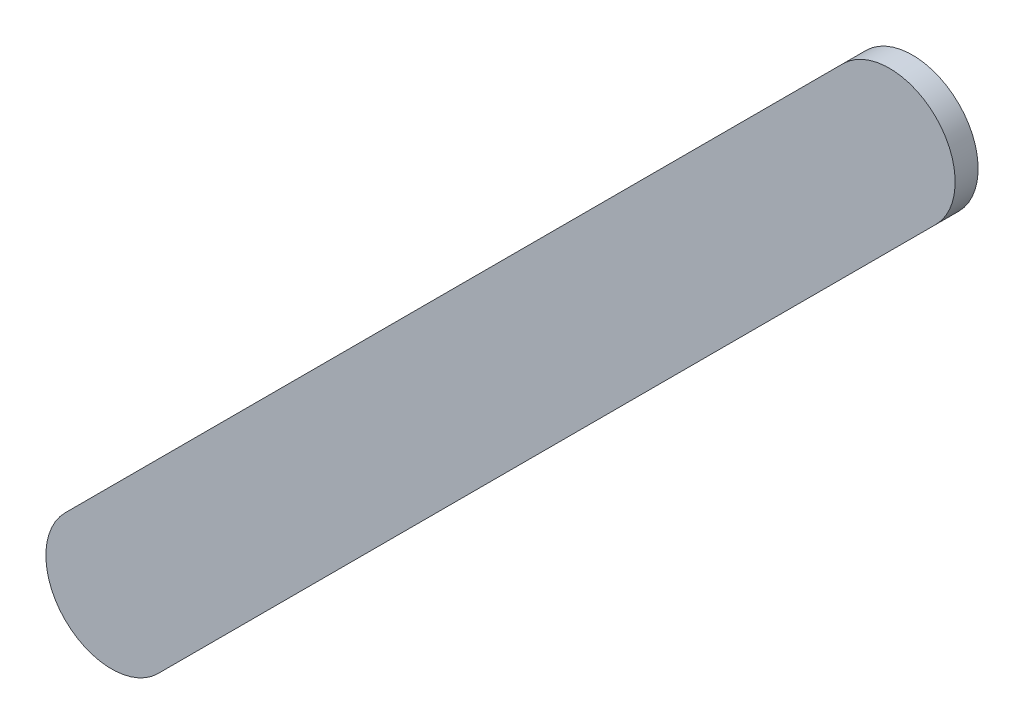
ISO-10303-21;
HEADER;
FILE_DESCRIPTION(('STEP AP214'),'2;1');
FILE_NAME('part.step','',(''),(''),'','','');
FILE_SCHEMA(('AUTOMOTIVE_DESIGN { 1 0 10303 214 1 1 1 1 }'));
ENDSEC;
DATA;
#1=APPLICATION_CONTEXT('core data for automotive mechanical design processes');
#2=APPLICATION_PROTOCOL_DEFINITION('international standard','automotive_design',2000,#1);
#3=PRODUCT_CONTEXT('',#1,'mechanical');
#4=PRODUCT('Part','Part','',(#3));
#5=PRODUCT_RELATED_PRODUCT_CATEGORY('part','',(#4));
#6=PRODUCT_DEFINITION_FORMATION('','',#4);
#7=PRODUCT_DEFINITION_CONTEXT('part definition',#1,'design');
#8=PRODUCT_DEFINITION('design','',#6,#7);
#9=PRODUCT_DEFINITION_SHAPE('','',#8);
#10=(LENGTH_UNIT() NAMED_UNIT(*) SI_UNIT(.MILLI.,.METRE.));
#11=(NAMED_UNIT(*) PLANE_ANGLE_UNIT() SI_UNIT($,.RADIAN.));
#12=(NAMED_UNIT(*) SI_UNIT($,.STERADIAN.) SOLID_ANGLE_UNIT());
#13=UNCERTAINTY_MEASURE_WITH_UNIT(LENGTH_MEASURE(1.E-05),#10,'distance_accuracy_value','');
#14=(GEOMETRIC_REPRESENTATION_CONTEXT(3) GLOBAL_UNCERTAINTY_ASSIGNED_CONTEXT((#13)) GLOBAL_UNIT_ASSIGNED_CONTEXT((#10,
#11,#12)) REPRESENTATION_CONTEXT('',''));
#15=CARTESIAN_POINT('',(0.,0.,0.));
#16=DIRECTION('',(0.,0.,1.));
#17=DIRECTION('',(1.,0.,0.));
#18=AXIS2_PLACEMENT_3D('',#15,#16,#17);
#19=CARTESIAN_POINT('',(90.48571,-141.65571,1.635));
#20=DIRECTION('',(0.,0.,1.));
#21=DIRECTION('',(1.,0.,0.));
#22=AXIS2_PLACEMENT_3D('',#19,#20,#21);
#23=PLANE('',#22);
#24=DIRECTION('',(0.707106781186548,0.707106781186548,0.));
#25=VECTOR('',#24,1.);
#26=CARTESIAN_POINT('',(90.48571,-141.65571,1.635));
#27=LINE('',#26,#25);
#28=CARTESIAN_POINT('',(90.48571,-141.65571,1.635));
#29=VERTEX_POINT('',#28);
#30=CARTESIAN_POINT('',(91.67071,-140.47071,1.635));
#31=VERTEX_POINT('',#30);
#32=EDGE_CURVE('E93',#29,#31,#27,.T.);
#33=ORIENTED_EDGE('',*,*,#32,.T.);
#34=CARTESIAN_POINT('',(91.5999995,-140.3999995,1.635));
#35=DIRECTION('',(0.,0.,1.));
#36=DIRECTION('',(0.707106781186048,-0.707106781187048,0.));
#37=AXIS2_PLACEMENT_3D('',#34,#35,#36);
#38=CIRCLE('',#37,0.09999974810218);
#39=CARTESIAN_POINT('',(91.529289,-140.329289,1.635));
#40=VERTEX_POINT('',#39);
#41=EDGE_CURVE('E76',#31,#40,#38,.T.);
#42=ORIENTED_EDGE('',*,*,#41,.T.);
#43=DIRECTION('',(-0.707106781186548,-0.707106781186548,0.));
#44=VECTOR('',#43,1.);
#45=CARTESIAN_POINT('',(91.529289,-140.329289,1.635));
#46=LINE('',#45,#44);
#47=CARTESIAN_POINT('',(90.344289,-141.514289,1.635));
#48=VERTEX_POINT('',#47);
#49=EDGE_CURVE('E20',#40,#48,#46,.T.);
#50=ORIENTED_EDGE('',*,*,#49,.T.);
#51=CARTESIAN_POINT('',(90.4149995,-141.5849995,1.635));
#52=DIRECTION('',(0.,0.,1.));
#53=DIRECTION('',(-0.707106781186548,0.707106781186548,0.));
#54=AXIS2_PLACEMENT_3D('',#51,#52,#53);
#55=CIRCLE('',#54,0.09999974810219);
#56=EDGE_CURVE('E11',#48,#29,#55,.T.);
#57=ORIENTED_EDGE('',*,*,#56,.T.);
#58=EDGE_LOOP('',(#33,#42,#50,#57));
#59=FACE_BOUND('',#58,.T.);
#60=ADVANCED_FACE('F17',(#59),#23,.T.);
#61=CARTESIAN_POINT('',(90.48571,-141.65571,1.6));
#62=DIRECTION('',(0.,0.,1.));
#63=DIRECTION('',(1.,0.,0.));
#64=AXIS2_PLACEMENT_3D('',#61,#62,#63);
#65=PLANE('',#64);
#66=CARTESIAN_POINT('',(90.4149995,-141.5849995,1.6));
#67=DIRECTION('',(0.,0.,1.));
#68=DIRECTION('',(-0.707106781186548,0.707106781186548,0.));
#69=AXIS2_PLACEMENT_3D('',#66,#67,#68);
#70=CIRCLE('',#69,0.09999974810219);
#71=CARTESIAN_POINT('',(90.344289,-141.514289,1.6));
#72=VERTEX_POINT('',#71);
#73=CARTESIAN_POINT('',(90.48571,-141.65571,1.6));
#74=VERTEX_POINT('',#73);
#75=EDGE_CURVE('E26',#72,#74,#70,.T.);
#76=ORIENTED_EDGE('',*,*,#75,.F.);
#77=DIRECTION('',(-0.707106781186548,-0.707106781186548,0.));
#78=VECTOR('',#77,1.);
#79=CARTESIAN_POINT('',(91.529289,-140.329289,1.6));
#80=LINE('',#79,#78);
#81=CARTESIAN_POINT('',(91.529289,-140.329289,1.6));
#82=VERTEX_POINT('',#81);
#83=EDGE_CURVE('E59',#82,#72,#80,.T.);
#84=ORIENTED_EDGE('',*,*,#83,.F.);
#85=CARTESIAN_POINT('',(91.5999995,-140.3999995,1.6));
#86=DIRECTION('',(0.,0.,1.));
#87=DIRECTION('',(0.707106781186048,-0.707106781187048,0.));
#88=AXIS2_PLACEMENT_3D('',#85,#86,#87);
#89=CIRCLE('',#88,0.09999974810218);
#90=CARTESIAN_POINT('',(91.67071,-140.47071,1.6));
#91=VERTEX_POINT('',#90);
#92=EDGE_CURVE('E95',#91,#82,#89,.T.);
#93=ORIENTED_EDGE('',*,*,#92,.F.);
#94=DIRECTION('',(0.707106781186548,0.707106781186548,0.));
#95=VECTOR('',#94,1.);
#96=CARTESIAN_POINT('',(90.48571,-141.65571,1.6));
#97=LINE('',#96,#95);
#98=EDGE_CURVE('E92',#74,#91,#97,.T.);
#99=ORIENTED_EDGE('',*,*,#98,.F.);
#100=EDGE_LOOP('',(#76,#84,#93,#99));
#101=FACE_BOUND('',#100,.T.);
#102=ADVANCED_FACE('F97',(#101),#65,.F.);
#103=CARTESIAN_POINT('',(90.4149995,-141.5849995,1.6));
#104=DIRECTION('',(0.,0.,-1.));
#105=DIRECTION('',(-0.707106781186548,0.707106781186548,0.));
#106=AXIS2_PLACEMENT_3D('',#103,#104,#105);
#107=CYLINDRICAL_SURFACE('',#106,0.09999974810219);
#108=ORIENTED_EDGE('',*,*,#75,.T.);
#109=DIRECTION('',(0.,0.,1.));
#110=VECTOR('',#109,1.);
#111=CARTESIAN_POINT('',(90.48571,-141.65571,1.6));
#112=LINE('',#111,#110);
#113=EDGE_CURVE('E82',#74,#29,#112,.T.);
#114=ORIENTED_EDGE('',*,*,#113,.T.);
#115=ORIENTED_EDGE('',*,*,#56,.F.);
#116=DIRECTION('',(0.,0.,1.));
#117=VECTOR('',#116,1.);
#118=CARTESIAN_POINT('',(90.344289,-141.514289,1.6));
#119=LINE('',#118,#117);
#120=EDGE_CURVE('E85',#72,#48,#119,.T.);
#121=ORIENTED_EDGE('',*,*,#120,.F.);
#122=EDGE_LOOP('',(#108,#114,#115,#121));
#123=FACE_BOUND('',#122,.T.);
#124=ADVANCED_FACE('F81',(#123),#107,.T.);
#125=CARTESIAN_POINT('',(91.529289,-140.329289,1.6));
#126=DIRECTION('',(0.707106781186548,-0.707106781186548,0.));
#127=DIRECTION('',(0.,0.,-1.));
#128=AXIS2_PLACEMENT_3D('',#125,#126,#127);
#129=PLANE('',#128);
#130=ORIENTED_EDGE('',*,*,#83,.T.);
#131=ORIENTED_EDGE('',*,*,#120,.T.);
#132=ORIENTED_EDGE('',*,*,#49,.F.);
#133=DIRECTION('',(0.,0.,1.));
#134=VECTOR('',#133,1.);
#135=CARTESIAN_POINT('',(91.529289,-140.329289,1.6));
#136=LINE('',#135,#134);
#137=EDGE_CURVE('E110',#82,#40,#136,.T.);
#138=ORIENTED_EDGE('',*,*,#137,.F.);
#139=EDGE_LOOP('',(#130,#131,#132,#138));
#140=FACE_BOUND('',#139,.T.);
#141=ADVANCED_FACE('F125',(#140),#129,.F.);
#142=CARTESIAN_POINT('',(91.5999995,-140.3999995,1.6));
#143=DIRECTION('',(0.,0.,-1.));
#144=DIRECTION('',(0.707106781186048,-0.707106781187048,0.));
#145=AXIS2_PLACEMENT_3D('',#142,#143,#144);
#146=CYLINDRICAL_SURFACE('',#145,0.09999974810218);
#147=ORIENTED_EDGE('',*,*,#92,.T.);
#148=ORIENTED_EDGE('',*,*,#137,.T.);
#149=ORIENTED_EDGE('',*,*,#41,.F.);
#150=DIRECTION('',(0.,0.,1.));
#151=VECTOR('',#150,1.);
#152=CARTESIAN_POINT('',(91.67071,-140.47071,1.6));
#153=LINE('',#152,#151);
#154=EDGE_CURVE('E100',#91,#31,#153,.T.);
#155=ORIENTED_EDGE('',*,*,#154,.F.);
#156=EDGE_LOOP('',(#147,#148,#149,#155));
#157=FACE_BOUND('',#156,.T.);
#158=ADVANCED_FACE('F126',(#157),#146,.T.);
#159=CARTESIAN_POINT('',(90.48571,-141.65571,1.6));
#160=DIRECTION('',(-0.707106781186548,0.707106781186548,0.));
#161=DIRECTION('',(0.,0.,1.));
#162=AXIS2_PLACEMENT_3D('',#159,#160,#161);
#163=PLANE('',#162);
#164=ORIENTED_EDGE('',*,*,#98,.T.);
#165=ORIENTED_EDGE('',*,*,#154,.T.);
#166=ORIENTED_EDGE('',*,*,#32,.F.);
#167=ORIENTED_EDGE('',*,*,#113,.F.);
#168=EDGE_LOOP('',(#164,#165,#166,#167));
#169=FACE_BOUND('',#168,.T.);
#170=ADVANCED_FACE('F90',(#169),#163,.F.);
#171=CLOSED_SHELL('',(#60,#102,#124,#141,#158,#170));
#172=MANIFOLD_SOLID_BREP('B1',#171);
#173=ADVANCED_BREP_SHAPE_REPRESENTATION('',(#18,#172),#14);
#174=SHAPE_DEFINITION_REPRESENTATION(#9,#173);
ENDSEC;
END-ISO-10303-21;
